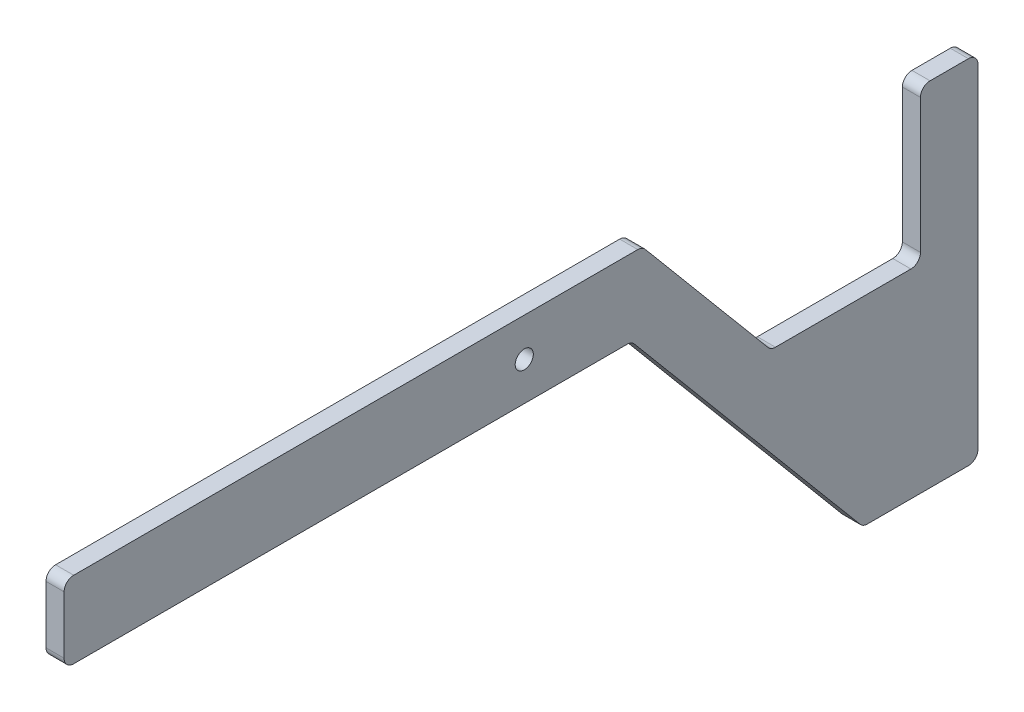
ISO-10303-21;
HEADER;
FILE_DESCRIPTION(('STEP AP214'),'2;1');
FILE_NAME('part.step','',(''),(''),'','','');
FILE_SCHEMA(('AUTOMOTIVE_DESIGN { 1 0 10303 214 1 1 1 1 }'));
ENDSEC;
DATA;
#1=APPLICATION_CONTEXT('core data for automotive mechanical design processes');
#2=APPLICATION_PROTOCOL_DEFINITION('international standard','automotive_design',2000,#1);
#3=PRODUCT_CONTEXT('',#1,'mechanical');
#4=PRODUCT('Part','Part','',(#3));
#5=PRODUCT_RELATED_PRODUCT_CATEGORY('part','',(#4));
#6=PRODUCT_DEFINITION_FORMATION('','',#4);
#7=PRODUCT_DEFINITION_CONTEXT('part definition',#1,'design');
#8=PRODUCT_DEFINITION('design','',#6,#7);
#9=PRODUCT_DEFINITION_SHAPE('','',#8);
#10=(LENGTH_UNIT() NAMED_UNIT(*) SI_UNIT(.MILLI.,.METRE.));
#11=(NAMED_UNIT(*) PLANE_ANGLE_UNIT() SI_UNIT($,.RADIAN.));
#12=(NAMED_UNIT(*) SI_UNIT($,.STERADIAN.) SOLID_ANGLE_UNIT());
#13=UNCERTAINTY_MEASURE_WITH_UNIT(LENGTH_MEASURE(1.E-05),#10,'distance_accuracy_value','');
#14=(GEOMETRIC_REPRESENTATION_CONTEXT(3) GLOBAL_UNCERTAINTY_ASSIGNED_CONTEXT((#13)) GLOBAL_UNIT_ASSIGNED_CONTEXT((#10,
#11,#12)) REPRESENTATION_CONTEXT('',''));
#15=CARTESIAN_POINT('',(0.,0.,0.));
#16=DIRECTION('',(0.,0.,1.));
#17=DIRECTION('',(1.,0.,0.));
#18=AXIS2_PLACEMENT_3D('',#15,#16,#17);
#19=CARTESIAN_POINT('',(1.5,0.,0.));
#20=DIRECTION('',(1.,0.,0.));
#21=DIRECTION('',(0.,0.,-1.));
#22=AXIS2_PLACEMENT_3D('',#19,#20,#21);
#23=PLANE('',#22);
#24=DIRECTION('',(0.,0.766044443118974,0.642787609686544));
#25=VECTOR('',#24,1.);
#26=CARTESIAN_POINT('',(1.5,29.1862932828329,-20.0716573882898));
#27=LINE('',#26,#25);
#28=CARTESIAN_POINT('',(1.5,4.35336795245555,-40.9089558740626));
#29=VERTEX_POINT('',#28);
#30=CARTESIAN_POINT('',(1.5,28.6192186132103,-20.5474895344201));
#31=VERTEX_POINT('',#30);
#32=EDGE_CURVE('E226',#29,#31,#27,.T.);
#33=ORIENTED_EDGE('',*,*,#32,.T.);
#34=CARTESIAN_POINT('',(1.5,27.5987932828329,-19.3313939809687));
#35=DIRECTION('',(1.,0.,0.));
#36=DIRECTION('',(0.,0.,-1.));
#37=AXIS2_PLACEMENT_3D('',#34,#35,#36);
#38=CIRCLE('',#37,1.5875);
#39=CARTESIAN_POINT('',(1.5,29.1862932828329,-19.3313939809687));
#40=VERTEX_POINT('',#39);
#41=EDGE_CURVE('E299',#31,#40,#38,.T.);
#42=ORIENTED_EDGE('',*,*,#41,.T.);
#43=DIRECTION('',(0.,0.,1.));
#44=VECTOR('',#43,1.);
#45=CARTESIAN_POINT('',(1.5,29.1862932828329,75.6680688155144));
#46=LINE('',#45,#44);
#47=CARTESIAN_POINT('',(1.5,29.1862932828329,74.0805688155144));
#48=VERTEX_POINT('',#47);
#49=EDGE_CURVE('E205',#40,#48,#46,.T.);
#50=ORIENTED_EDGE('',*,*,#49,.T.);
#51=CARTESIAN_POINT('',(1.5,27.5987932828329,74.0805688155144));
#52=DIRECTION('',(1.,0.,0.));
#53=DIRECTION('',(0.,0.,-1.));
#54=AXIS2_PLACEMENT_3D('',#51,#52,#53);
#55=CIRCLE('',#54,1.5875);
#56=CARTESIAN_POINT('',(1.5,27.5987932828329,75.6680688155144));
#57=VERTEX_POINT('',#56);
#58=EDGE_CURVE('E281',#48,#57,#55,.T.);
#59=ORIENTED_EDGE('',*,*,#58,.T.);
#60=DIRECTION('',(0.,-1.,0.));
#61=VECTOR('',#60,1.);
#62=CARTESIAN_POINT('',(1.5,16.4862932828329,75.6680688155144));
#63=LINE('',#62,#61);
#64=CARTESIAN_POINT('',(1.5,18.0737932828329,75.6680688155144));
#65=VERTEX_POINT('',#64);
#66=EDGE_CURVE('E397',#57,#65,#63,.T.);
#67=ORIENTED_EDGE('',*,*,#66,.T.);
#68=CARTESIAN_POINT('',(1.5,18.0737932828329,74.0805688155144));
#69=DIRECTION('',(1.,0.,0.));
#70=DIRECTION('',(0.,0.,-1.));
#71=AXIS2_PLACEMENT_3D('',#68,#69,#70);
#72=CIRCLE('',#71,1.5875);
#73=CARTESIAN_POINT('',(1.5,16.4862932828329,74.0805688155144));
#74=VERTEX_POINT('',#73);
#75=EDGE_CURVE('E284',#65,#74,#72,.T.);
#76=ORIENTED_EDGE('',*,*,#75,.T.);
#77=DIRECTION('',(0.,0.,-1.));
#78=VECTOR('',#77,1.);
#79=CARTESIAN_POINT('',(1.5,16.4862932828329,-18.2942182733514));
#80=LINE('',#79,#78);
#81=CARTESIAN_POINT('',(1.5,16.4862932828329,-17.5539548660304));
#82=VERTEX_POINT('',#81);
#83=EDGE_CURVE('E385',#74,#82,#80,.T.);
#84=ORIENTED_EDGE('',*,*,#83,.T.);
#85=CARTESIAN_POINT('',(1.5,14.8987932828329,-17.5539548660304));
#86=DIRECTION('',(1.,0.,0.));
#87=DIRECTION('',(0.,0.,-1.));
#88=AXIS2_PLACEMENT_3D('',#85,#86,#87);
#89=CIRCLE('',#88,1.5875);
#90=CARTESIAN_POINT('',(1.5,15.9192186132103,-18.7700504194817));
#91=VERTEX_POINT('',#90);
#92=EDGE_CURVE('E11',#82,#91,#89,.F.);
#93=ORIENTED_EDGE('',*,*,#92,.T.);
#94=DIRECTION('',(0.,-0.766044443118974,-0.642787609686544));
#95=VECTOR('',#94,1.);
#96=CARTESIAN_POINT('',(1.5,16.4862932828329,-18.2942182733514));
#97=LINE('',#96,#95);
#98=CARTESIAN_POINT('',(1.5,-28.6192186132103,-56.1422366693841));
#99=VERTEX_POINT('',#98);
#100=EDGE_CURVE('E383',#91,#99,#97,.T.);
#101=ORIENTED_EDGE('',*,*,#100,.T.);
#102=CARTESIAN_POINT('',(1.5,-27.5987932828329,-57.3583322228355));
#103=DIRECTION('',(1.,0.,0.));
#104=DIRECTION('',(0.,0.,-1.));
#105=AXIS2_PLACEMENT_3D('',#102,#103,#104);
#106=CIRCLE('',#105,1.5875);
#107=CARTESIAN_POINT('',(1.5,-29.1862932828329,-57.3583322228355));
#108=VERTEX_POINT('',#107);
#109=EDGE_CURVE('E287',#99,#108,#106,.T.);
#110=ORIENTED_EDGE('',*,*,#109,.T.);
#111=DIRECTION('',(0.,0.,-1.));
#112=VECTOR('',#111,1.);
#113=CARTESIAN_POINT('',(1.5,-29.1862932828329,-56.6180688155144));
#114=LINE('',#113,#112);
#115=CARTESIAN_POINT('',(1.5,-29.1862932828329,-74.0805688155144));
#116=VERTEX_POINT('',#115);
#117=EDGE_CURVE('E390',#108,#116,#114,.T.);
#118=ORIENTED_EDGE('',*,*,#117,.T.);
#119=CARTESIAN_POINT('',(1.5,-27.5987932828329,-74.0805688155144));
#120=DIRECTION('',(1.,0.,0.));
#121=DIRECTION('',(0.,0.,-1.));
#122=AXIS2_PLACEMENT_3D('',#119,#120,#121);
#123=CIRCLE('',#122,1.5875);
#124=CARTESIAN_POINT('',(1.5,-27.5987932828329,-75.6680688155144));
#125=VERTEX_POINT('',#124);
#126=EDGE_CURVE('E290',#116,#125,#123,.T.);
#127=ORIENTED_EDGE('',*,*,#126,.T.);
#128=DIRECTION('',(0.,1.,0.));
#129=VECTOR('',#128,1.);
#130=CARTESIAN_POINT('',(1.5,29.1862932828329,-75.6680688155144));
#131=LINE('',#130,#129);
#132=CARTESIAN_POINT('',(1.5,27.5987932828329,-75.6680688155144));
#133=VERTEX_POINT('',#132);
#134=EDGE_CURVE('E395',#125,#133,#131,.T.);
#135=ORIENTED_EDGE('',*,*,#134,.T.);
#136=CARTESIAN_POINT('',(1.5,27.5987932828329,-74.0805688155144));
#137=DIRECTION('',(1.,0.,0.));
#138=DIRECTION('',(0.,0.,-1.));
#139=AXIS2_PLACEMENT_3D('',#136,#137,#138);
#140=CIRCLE('',#139,1.5875);
#141=CARTESIAN_POINT('',(1.5,29.1862932828329,-74.0805688155144));
#142=VERTEX_POINT('',#141);
#143=EDGE_CURVE('E293',#133,#142,#140,.T.);
#144=ORIENTED_EDGE('',*,*,#143,.T.);
#145=DIRECTION('',(0.,0.,1.));
#146=VECTOR('',#145,1.);
#147=CARTESIAN_POINT('',(1.5,29.1862932828329,-66.1430688155144));
#148=LINE('',#147,#146);
#149=CARTESIAN_POINT('',(1.5,29.1862932828329,-67.7305688155144));
#150=VERTEX_POINT('',#149);
#151=EDGE_CURVE('E404',#142,#150,#148,.T.);
#152=ORIENTED_EDGE('',*,*,#151,.T.);
#153=CARTESIAN_POINT('',(1.5,27.5987932828329,-67.7305688155144));
#154=DIRECTION('',(1.,0.,0.));
#155=DIRECTION('',(0.,0.,-1.));
#156=AXIS2_PLACEMENT_3D('',#153,#154,#155);
#157=CIRCLE('',#156,1.5875);
#158=CARTESIAN_POINT('',(1.5,27.5987932828329,-66.1430688155144));
#159=VERTEX_POINT('',#158);
#160=EDGE_CURVE('E296',#150,#159,#157,.T.);
#161=ORIENTED_EDGE('',*,*,#160,.T.);
#162=DIRECTION('',(0.,-1.,0.));
#163=VECTOR('',#162,1.);
#164=CARTESIAN_POINT('',(1.5,3.78629328283292,-66.1430688155144));
#165=LINE('',#164,#163);
#166=CARTESIAN_POINT('',(1.5,5.37379328283292,-66.1430688155144));
#167=VERTEX_POINT('',#166);
#168=EDGE_CURVE('E408',#159,#167,#165,.T.);
#169=ORIENTED_EDGE('',*,*,#168,.T.);
#170=CARTESIAN_POINT('',(1.5,5.37379328283292,-64.5555688155144));
#171=DIRECTION('',(1.,0.,0.));
#172=DIRECTION('',(0.,0.,-1.));
#173=AXIS2_PLACEMENT_3D('',#170,#171,#172);
#174=CIRCLE('',#173,1.5875);
#175=CARTESIAN_POINT('',(1.5,3.78629328283292,-64.5555688155144));
#176=VERTEX_POINT('',#175);
#177=EDGE_CURVE('E68',#167,#176,#174,.F.);
#178=ORIENTED_EDGE('',*,*,#177,.T.);
#179=DIRECTION('',(0.,0.,1.));
#180=VECTOR('',#179,1.);
#181=CARTESIAN_POINT('',(1.5,3.78629328283292,-41.384788020193));
#182=LINE('',#181,#180);
#183=CARTESIAN_POINT('',(1.5,3.78629328283292,-42.125051427514));
#184=VERTEX_POINT('',#183);
#185=EDGE_CURVE('E410',#176,#184,#182,.T.);
#186=ORIENTED_EDGE('',*,*,#185,.T.);
#187=CARTESIAN_POINT('',(1.5,5.37379328283293,-42.125051427514));
#188=DIRECTION('',(1.,0.,0.));
#189=DIRECTION('',(0.,0.,-1.));
#190=AXIS2_PLACEMENT_3D('',#187,#188,#189);
#191=CIRCLE('',#190,1.5875);
#192=EDGE_CURVE('E360',#184,#29,#191,.F.);
#193=ORIENTED_EDGE('',*,*,#192,.T.);
#194=EDGE_LOOP('',(#33,#42,#50,#59,#67,#76,#84,#93,#101,#110,#118,#127,#135,#144,#152,#161,#169,
#178,#186,#193));
#195=FACE_BOUND('',#194,.T.);
#196=CARTESIAN_POINT('',(1.5,22.8362932828329,-0.531931184485581));
#197=DIRECTION('',(1.,0.,0.));
#198=DIRECTION('',(0.,0.,-1.));
#199=AXIS2_PLACEMENT_3D('',#196,#197,#198);
#200=CIRCLE('',#199,1.49999999999991);
#201=CARTESIAN_POINT('',(1.5,22.8362932828329,-2.03193118448549));
#202=VERTEX_POINT('',#201);
#203=EDGE_CURVE('E215',#202,#202,#200,.T.);
#204=ORIENTED_EDGE('',*,*,#203,.F.);
#205=EDGE_LOOP('',(#204));
#206=FACE_BOUND('',#205,.T.);
#207=ADVANCED_FACE('F45',(#195,#206),#23,.T.);
#208=CARTESIAN_POINT('',(-1.5,0.,0.));
#209=DIRECTION('',(1.,0.,0.));
#210=DIRECTION('',(0.,0.,-1.));
#211=AXIS2_PLACEMENT_3D('',#208,#209,#210);
#212=PLANE('',#211);
#213=DIRECTION('',(0.,0.,1.));
#214=VECTOR('',#213,1.);
#215=CARTESIAN_POINT('',(-1.5,29.1862932828329,75.6680688155144));
#216=LINE('',#215,#214);
#217=CARTESIAN_POINT('',(-1.5,29.1862932828329,-19.3313939809687));
#218=VERTEX_POINT('',#217);
#219=CARTESIAN_POINT('',(-1.5,29.1862932828329,74.0805688155144));
#220=VERTEX_POINT('',#219);
#221=EDGE_CURVE('E202',#218,#220,#216,.T.);
#222=ORIENTED_EDGE('',*,*,#221,.F.);
#223=CARTESIAN_POINT('',(-1.5,27.5987932828329,-19.3313939809687));
#224=DIRECTION('',(1.,0.,0.));
#225=DIRECTION('',(0.,0.,-1.));
#226=AXIS2_PLACEMENT_3D('',#223,#224,#225);
#227=CIRCLE('',#226,1.5875);
#228=CARTESIAN_POINT('',(-1.5,28.6192186132103,-20.5474895344201));
#229=VERTEX_POINT('',#228);
#230=EDGE_CURVE('E184',#218,#229,#227,.F.);
#231=ORIENTED_EDGE('',*,*,#230,.T.);
#232=DIRECTION('',(0.,0.766044443118974,0.642787609686544));
#233=VECTOR('',#232,1.);
#234=CARTESIAN_POINT('',(-1.5,29.1862932828329,-20.0716573882898));
#235=LINE('',#234,#233);
#236=CARTESIAN_POINT('',(-1.5,4.35336795245555,-40.9089558740626));
#237=VERTEX_POINT('',#236);
#238=EDGE_CURVE('E255',#237,#229,#235,.T.);
#239=ORIENTED_EDGE('',*,*,#238,.F.);
#240=CARTESIAN_POINT('',(-1.5,5.37379328283293,-42.125051427514));
#241=DIRECTION('',(1.,0.,0.));
#242=DIRECTION('',(0.,0.,-1.));
#243=AXIS2_PLACEMENT_3D('',#240,#241,#242);
#244=CIRCLE('',#243,1.5875);
#245=CARTESIAN_POINT('',(-1.5,3.78629328283292,-42.125051427514));
#246=VERTEX_POINT('',#245);
#247=EDGE_CURVE('E357',#237,#246,#244,.T.);
#248=ORIENTED_EDGE('',*,*,#247,.T.);
#249=DIRECTION('',(0.,0.,1.));
#250=VECTOR('',#249,1.);
#251=CARTESIAN_POINT('',(-1.5,3.78629328283292,-41.384788020193));
#252=LINE('',#251,#250);
#253=CARTESIAN_POINT('',(-1.5,3.78629328283292,-64.5555688155144));
#254=VERTEX_POINT('',#253);
#255=EDGE_CURVE('E252',#254,#246,#252,.T.);
#256=ORIENTED_EDGE('',*,*,#255,.F.);
#257=CARTESIAN_POINT('',(-1.5,5.37379328283292,-64.5555688155144));
#258=DIRECTION('',(1.,0.,0.));
#259=DIRECTION('',(0.,0.,-1.));
#260=AXIS2_PLACEMENT_3D('',#257,#258,#259);
#261=CIRCLE('',#260,1.5875);
#262=CARTESIAN_POINT('',(-1.5,5.37379328283292,-66.1430688155144));
#263=VERTEX_POINT('',#262);
#264=EDGE_CURVE('E363',#254,#263,#261,.T.);
#265=ORIENTED_EDGE('',*,*,#264,.T.);
#266=DIRECTION('',(0.,-1.,0.));
#267=VECTOR('',#266,1.);
#268=CARTESIAN_POINT('',(-1.5,3.78629328283292,-66.1430688155144));
#269=LINE('',#268,#267);
#270=CARTESIAN_POINT('',(-1.5,27.5987932828329,-66.1430688155144));
#271=VERTEX_POINT('',#270);
#272=EDGE_CURVE('E248',#271,#263,#269,.T.);
#273=ORIENTED_EDGE('',*,*,#272,.F.);
#274=CARTESIAN_POINT('',(-1.5,27.5987932828329,-67.7305688155144));
#275=DIRECTION('',(1.,0.,0.));
#276=DIRECTION('',(0.,0.,-1.));
#277=AXIS2_PLACEMENT_3D('',#274,#275,#276);
#278=CIRCLE('',#277,1.5875);
#279=CARTESIAN_POINT('',(-1.5,29.1862932828329,-67.7305688155144));
#280=VERTEX_POINT('',#279);
#281=EDGE_CURVE('E196',#271,#280,#278,.F.);
#282=ORIENTED_EDGE('',*,*,#281,.T.);
#283=DIRECTION('',(0.,0.,1.));
#284=VECTOR('',#283,1.);
#285=CARTESIAN_POINT('',(-1.5,29.1862932828329,-66.1430688155144));
#286=LINE('',#285,#284);
#287=CARTESIAN_POINT('',(-1.5,29.1862932828329,-74.0805688155144));
#288=VERTEX_POINT('',#287);
#289=EDGE_CURVE('E244',#288,#280,#286,.T.);
#290=ORIENTED_EDGE('',*,*,#289,.F.);
#291=CARTESIAN_POINT('',(-1.5,27.5987932828329,-74.0805688155144));
#292=DIRECTION('',(1.,0.,0.));
#293=DIRECTION('',(0.,0.,-1.));
#294=AXIS2_PLACEMENT_3D('',#291,#292,#293);
#295=CIRCLE('',#294,1.5875);
#296=CARTESIAN_POINT('',(-1.5,27.5987932828329,-75.6680688155144));
#297=VERTEX_POINT('',#296);
#298=EDGE_CURVE('E271',#288,#297,#295,.F.);
#299=ORIENTED_EDGE('',*,*,#298,.T.);
#300=DIRECTION('',(0.,1.,0.));
#301=VECTOR('',#300,1.);
#302=CARTESIAN_POINT('',(-1.5,29.1862932828329,-75.6680688155144));
#303=LINE('',#302,#301);
#304=CARTESIAN_POINT('',(-1.5,-27.5987932828329,-75.6680688155144));
#305=VERTEX_POINT('',#304);
#306=EDGE_CURVE('E240',#305,#297,#303,.T.);
#307=ORIENTED_EDGE('',*,*,#306,.F.);
#308=CARTESIAN_POINT('',(-1.5,-27.5987932828329,-74.0805688155144));
#309=DIRECTION('',(1.,0.,0.));
#310=DIRECTION('',(0.,0.,-1.));
#311=AXIS2_PLACEMENT_3D('',#308,#309,#310);
#312=CIRCLE('',#311,1.5875);
#313=CARTESIAN_POINT('',(-1.5,-29.1862932828329,-74.0805688155144));
#314=VERTEX_POINT('',#313);
#315=EDGE_CURVE('E268',#305,#314,#312,.F.);
#316=ORIENTED_EDGE('',*,*,#315,.T.);
#317=DIRECTION('',(0.,0.,-1.));
#318=VECTOR('',#317,1.);
#319=CARTESIAN_POINT('',(-1.5,-29.1862932828329,-56.6180688155144));
#320=LINE('',#319,#318);
#321=CARTESIAN_POINT('',(-1.5,-29.1862932828329,-57.3583322228355));
#322=VERTEX_POINT('',#321);
#323=EDGE_CURVE('E236',#322,#314,#320,.T.);
#324=ORIENTED_EDGE('',*,*,#323,.F.);
#325=CARTESIAN_POINT('',(-1.5,-27.5987932828329,-57.3583322228355));
#326=DIRECTION('',(1.,0.,0.));
#327=DIRECTION('',(0.,0.,-1.));
#328=AXIS2_PLACEMENT_3D('',#325,#326,#327);
#329=CIRCLE('',#328,1.5875);
#330=CARTESIAN_POINT('',(-1.5,-28.6192186132103,-56.1422366693841));
#331=VERTEX_POINT('',#330);
#332=EDGE_CURVE('E265',#322,#331,#329,.F.);
#333=ORIENTED_EDGE('',*,*,#332,.T.);
#334=DIRECTION('',(0.,-0.766044443118974,-0.642787609686544));
#335=VECTOR('',#334,1.);
#336=CARTESIAN_POINT('',(-1.5,16.4862932828329,-18.2942182733514));
#337=LINE('',#336,#335);
#338=CARTESIAN_POINT('',(-1.5,15.9192186132103,-18.7700504194817));
#339=VERTEX_POINT('',#338);
#340=EDGE_CURVE('E232',#339,#331,#337,.T.);
#341=ORIENTED_EDGE('',*,*,#340,.F.);
#342=CARTESIAN_POINT('',(-1.5,14.8987932828329,-17.5539548660304));
#343=DIRECTION('',(1.,0.,0.));
#344=DIRECTION('',(0.,0.,-1.));
#345=AXIS2_PLACEMENT_3D('',#342,#343,#344);
#346=CIRCLE('',#345,1.5875);
#347=CARTESIAN_POINT('',(-1.5,16.4862932828329,-17.5539548660304));
#348=VERTEX_POINT('',#347);
#349=EDGE_CURVE('E54',#339,#348,#346,.T.);
#350=ORIENTED_EDGE('',*,*,#349,.T.);
#351=DIRECTION('',(0.,0.,-1.));
#352=VECTOR('',#351,1.);
#353=CARTESIAN_POINT('',(-1.5,16.4862932828329,-18.2942182733514));
#354=LINE('',#353,#352);
#355=CARTESIAN_POINT('',(-1.5,16.4862932828329,74.0805688155144));
#356=VERTEX_POINT('',#355);
#357=EDGE_CURVE('E220',#356,#348,#354,.T.);
#358=ORIENTED_EDGE('',*,*,#357,.F.);
#359=CARTESIAN_POINT('',(-1.5,18.0737932828329,74.0805688155144));
#360=DIRECTION('',(1.,0.,0.));
#361=DIRECTION('',(0.,0.,-1.));
#362=AXIS2_PLACEMENT_3D('',#359,#360,#361);
#363=CIRCLE('',#362,1.5875);
#364=CARTESIAN_POINT('',(-1.5,18.0737932828329,75.6680688155144));
#365=VERTEX_POINT('',#364);
#366=EDGE_CURVE('E262',#356,#365,#363,.F.);
#367=ORIENTED_EDGE('',*,*,#366,.T.);
#368=DIRECTION('',(0.,-1.,0.));
#369=VECTOR('',#368,1.);
#370=CARTESIAN_POINT('',(-1.5,16.4862932828329,75.6680688155144));
#371=LINE('',#370,#369);
#372=CARTESIAN_POINT('',(-1.5,27.5987932828329,75.6680688155144));
#373=VERTEX_POINT('',#372);
#374=EDGE_CURVE('E214',#373,#365,#371,.T.);
#375=ORIENTED_EDGE('',*,*,#374,.F.);
#376=CARTESIAN_POINT('',(-1.5,27.5987932828329,74.0805688155144));
#377=DIRECTION('',(1.,0.,0.));
#378=DIRECTION('',(0.,0.,-1.));
#379=AXIS2_PLACEMENT_3D('',#376,#377,#378);
#380=CIRCLE('',#379,1.5875);
#381=EDGE_CURVE('E207',#373,#220,#380,.F.);
#382=ORIENTED_EDGE('',*,*,#381,.T.);
#383=EDGE_LOOP('',(#222,#231,#239,#248,#256,#265,#273,#282,#290,#299,#307,#316,#324,#333,#341,
#350,#358,#367,#375,#382));
#384=FACE_BOUND('',#383,.T.);
#385=CARTESIAN_POINT('',(-1.5,22.8362932828329,-0.531931184485581));
#386=DIRECTION('',(1.,0.,0.));
#387=DIRECTION('',(0.,0.,-1.));
#388=AXIS2_PLACEMENT_3D('',#385,#386,#387);
#389=CIRCLE('',#388,1.49999999999991);
#390=CARTESIAN_POINT('',(-1.5,22.8362932828329,-2.03193118448549));
#391=VERTEX_POINT('',#390);
#392=EDGE_CURVE('E223',#391,#391,#389,.T.);
#393=ORIENTED_EDGE('',*,*,#392,.T.);
#394=EDGE_LOOP('',(#393));
#395=FACE_BOUND('',#394,.T.);
#396=ADVANCED_FACE('F210',(#384,#395),#212,.F.);
#397=CARTESIAN_POINT('',(1.5,29.1862932828329,75.6680688155144));
#398=DIRECTION('',(0.,-1.,0.));
#399=DIRECTION('',(0.,0.,-1.));
#400=AXIS2_PLACEMENT_3D('',#397,#398,#399);
#401=PLANE('',#400);
#402=ORIENTED_EDGE('',*,*,#49,.F.);
#403=DIRECTION('',(-1.,0.,0.));
#404=VECTOR('',#403,1.);
#405=CARTESIAN_POINT('',(1.5,29.1862932828329,-19.3313939809687));
#406=LINE('',#405,#404);
#407=EDGE_CURVE('E188',#40,#218,#406,.T.);
#408=ORIENTED_EDGE('',*,*,#407,.T.);
#409=ORIENTED_EDGE('',*,*,#221,.T.);
#410=DIRECTION('',(-1.,0.,0.));
#411=VECTOR('',#410,1.);
#412=CARTESIAN_POINT('',(1.5,29.1862932828329,74.0805688155144));
#413=LINE('',#412,#411);
#414=EDGE_CURVE('E208',#220,#48,#413,.F.);
#415=ORIENTED_EDGE('',*,*,#414,.T.);
#416=EDGE_LOOP('',(#402,#408,#409,#415));
#417=FACE_BOUND('',#416,.T.);
#418=ADVANCED_FACE('F201',(#417),#401,.F.);
#419=CARTESIAN_POINT('',(1.5,16.4862932828329,75.6680688155144));
#420=DIRECTION('',(0.,0.,-1.));
#421=DIRECTION('',(-1.,0.,0.));
#422=AXIS2_PLACEMENT_3D('',#419,#420,#421);
#423=PLANE('',#422);
#424=ORIENTED_EDGE('',*,*,#374,.T.);
#425=DIRECTION('',(-1.,0.,0.));
#426=VECTOR('',#425,1.);
#427=CARTESIAN_POINT('',(1.5,18.0737932828329,75.6680688155144));
#428=LINE('',#427,#426);
#429=EDGE_CURVE('E354',#365,#65,#428,.F.);
#430=ORIENTED_EDGE('',*,*,#429,.T.);
#431=ORIENTED_EDGE('',*,*,#66,.F.);
#432=DIRECTION('',(-1.,0.,0.));
#433=VECTOR('',#432,1.);
#434=CARTESIAN_POINT('',(1.5,27.5987932828329,75.6680688155144));
#435=LINE('',#434,#433);
#436=EDGE_CURVE('E350',#57,#373,#435,.T.);
#437=ORIENTED_EDGE('',*,*,#436,.T.);
#438=EDGE_LOOP('',(#424,#430,#431,#437));
#439=FACE_BOUND('',#438,.T.);
#440=ADVANCED_FACE('F497',(#439),#423,.F.);
#441=CARTESIAN_POINT('',(1.5,16.4862932828329,-18.2942182733514));
#442=DIRECTION('',(0.,1.,0.));
#443=DIRECTION('',(0.,0.,1.));
#444=AXIS2_PLACEMENT_3D('',#441,#442,#443);
#445=PLANE('',#444);
#446=ORIENTED_EDGE('',*,*,#83,.F.);
#447=DIRECTION('',(-1.,0.,0.));
#448=VECTOR('',#447,1.);
#449=CARTESIAN_POINT('',(1.5,16.4862932828329,74.0805688155144));
#450=LINE('',#449,#448);
#451=EDGE_CURVE('E346',#74,#356,#450,.T.);
#452=ORIENTED_EDGE('',*,*,#451,.T.);
#453=ORIENTED_EDGE('',*,*,#357,.T.);
#454=DIRECTION('',(-1.,0.,0.));
#455=VECTOR('',#454,1.);
#456=CARTESIAN_POINT('',(1.5,16.4862932828329,-17.5539548660304));
#457=LINE('',#456,#455);
#458=EDGE_CURVE('E343',#348,#82,#457,.F.);
#459=ORIENTED_EDGE('',*,*,#458,.T.);
#460=EDGE_LOOP('',(#446,#452,#453,#459));
#461=FACE_BOUND('',#460,.T.);
#462=ADVANCED_FACE('F375',(#461),#445,.F.);
#463=CARTESIAN_POINT('',(1.5,16.4862932828329,-18.2942182733514));
#464=DIRECTION('',(0.,0.642787609686544,-0.766044443118974));
#465=DIRECTION('',(0.,0.766044443118974,0.642787609686544));
#466=AXIS2_PLACEMENT_3D('',#463,#464,#465);
#467=PLANE('',#466);
#468=ORIENTED_EDGE('',*,*,#340,.T.);
#469=DIRECTION('',(-1.,0.,0.));
#470=VECTOR('',#469,1.);
#471=CARTESIAN_POINT('',(1.5,-28.6192186132103,-56.1422366693841));
#472=LINE('',#471,#470);
#473=EDGE_CURVE('E340',#331,#99,#472,.F.);
#474=ORIENTED_EDGE('',*,*,#473,.T.);
#475=ORIENTED_EDGE('',*,*,#100,.F.);
#476=DIRECTION('',(-1.,0.,0.));
#477=VECTOR('',#476,1.);
#478=CARTESIAN_POINT('',(-1.5,15.9192186132103,-18.7700504194817));
#479=LINE('',#478,#477);
#480=EDGE_CURVE('E336',#91,#339,#479,.T.);
#481=ORIENTED_EDGE('',*,*,#480,.T.);
#482=EDGE_LOOP('',(#468,#474,#475,#481));
#483=FACE_BOUND('',#482,.T.);
#484=ADVANCED_FACE('F387',(#483),#467,.F.);
#485=CARTESIAN_POINT('',(1.5,-29.1862932828329,-56.6180688155144));
#486=DIRECTION('',(0.,1.,0.));
#487=DIRECTION('',(0.,0.,1.));
#488=AXIS2_PLACEMENT_3D('',#485,#486,#487);
#489=PLANE('',#488);
#490=ORIENTED_EDGE('',*,*,#323,.T.);
#491=DIRECTION('',(-1.,0.,0.));
#492=VECTOR('',#491,1.);
#493=CARTESIAN_POINT('',(1.5,-29.1862932828329,-74.0805688155144));
#494=LINE('',#493,#492);
#495=EDGE_CURVE('E333',#314,#116,#494,.F.);
#496=ORIENTED_EDGE('',*,*,#495,.T.);
#497=ORIENTED_EDGE('',*,*,#117,.F.);
#498=DIRECTION('',(-1.,0.,0.));
#499=VECTOR('',#498,1.);
#500=CARTESIAN_POINT('',(1.5,-29.1862932828329,-57.3583322228355));
#501=LINE('',#500,#499);
#502=EDGE_CURVE('E329',#108,#322,#501,.T.);
#503=ORIENTED_EDGE('',*,*,#502,.T.);
#504=EDGE_LOOP('',(#490,#496,#497,#503));
#505=FACE_BOUND('',#504,.T.);
#506=ADVANCED_FACE('F455',(#505),#489,.F.);
#507=CARTESIAN_POINT('',(1.5,29.1862932828329,-75.6680688155144));
#508=DIRECTION('',(0.,0.,1.));
#509=DIRECTION('',(1.,0.,0.));
#510=AXIS2_PLACEMENT_3D('',#507,#508,#509);
#511=PLANE('',#510);
#512=ORIENTED_EDGE('',*,*,#306,.T.);
#513=DIRECTION('',(-1.,0.,0.));
#514=VECTOR('',#513,1.);
#515=CARTESIAN_POINT('',(1.5,27.5987932828329,-75.6680688155144));
#516=LINE('',#515,#514);
#517=EDGE_CURVE('E326',#297,#133,#516,.F.);
#518=ORIENTED_EDGE('',*,*,#517,.T.);
#519=ORIENTED_EDGE('',*,*,#134,.F.);
#520=DIRECTION('',(-1.,0.,0.));
#521=VECTOR('',#520,1.);
#522=CARTESIAN_POINT('',(1.5,-27.5987932828329,-75.6680688155144));
#523=LINE('',#522,#521);
#524=EDGE_CURVE('E322',#125,#305,#523,.T.);
#525=ORIENTED_EDGE('',*,*,#524,.T.);
#526=EDGE_LOOP('',(#512,#518,#519,#525));
#527=FACE_BOUND('',#526,.T.);
#528=ADVANCED_FACE('F446',(#527),#511,.F.);
#529=CARTESIAN_POINT('',(1.5,29.1862932828329,-66.1430688155144));
#530=DIRECTION('',(0.,-1.,0.));
#531=DIRECTION('',(0.,0.,-1.));
#532=AXIS2_PLACEMENT_3D('',#529,#530,#531);
#533=PLANE('',#532);
#534=ORIENTED_EDGE('',*,*,#289,.T.);
#535=DIRECTION('',(-1.,0.,0.));
#536=VECTOR('',#535,1.);
#537=CARTESIAN_POINT('',(1.5,29.1862932828329,-67.7305688155144));
#538=LINE('',#537,#536);
#539=EDGE_CURVE('E319',#280,#150,#538,.F.);
#540=ORIENTED_EDGE('',*,*,#539,.T.);
#541=ORIENTED_EDGE('',*,*,#151,.F.);
#542=DIRECTION('',(-1.,0.,0.));
#543=VECTOR('',#542,1.);
#544=CARTESIAN_POINT('',(1.5,29.1862932828329,-74.0805688155144));
#545=LINE('',#544,#543);
#546=EDGE_CURVE('E315',#142,#288,#545,.T.);
#547=ORIENTED_EDGE('',*,*,#546,.T.);
#548=EDGE_LOOP('',(#534,#540,#541,#547));
#549=FACE_BOUND('',#548,.T.);
#550=ADVANCED_FACE('F437',(#549),#533,.F.);
#551=CARTESIAN_POINT('',(1.5,3.78629328283292,-66.1430688155144));
#552=DIRECTION('',(0.,0.,-1.));
#553=DIRECTION('',(-1.,0.,0.));
#554=AXIS2_PLACEMENT_3D('',#551,#552,#553);
#555=PLANE('',#554);
#556=ORIENTED_EDGE('',*,*,#272,.T.);
#557=DIRECTION('',(-1.,0.,0.));
#558=VECTOR('',#557,1.);
#559=CARTESIAN_POINT('',(1.5,5.37379328283292,-66.1430688155144));
#560=LINE('',#559,#558);
#561=EDGE_CURVE('E312',#263,#167,#560,.F.);
#562=ORIENTED_EDGE('',*,*,#561,.T.);
#563=ORIENTED_EDGE('',*,*,#168,.F.);
#564=DIRECTION('',(-1.,0.,0.));
#565=VECTOR('',#564,1.);
#566=CARTESIAN_POINT('',(1.5,27.5987932828329,-66.1430688155144));
#567=LINE('',#566,#565);
#568=EDGE_CURVE('E308',#159,#271,#567,.T.);
#569=ORIENTED_EDGE('',*,*,#568,.T.);
#570=EDGE_LOOP('',(#556,#562,#563,#569));
#571=FACE_BOUND('',#570,.T.);
#572=ADVANCED_FACE('F428',(#571),#555,.F.);
#573=CARTESIAN_POINT('',(1.5,3.78629328283292,-41.384788020193));
#574=DIRECTION('',(0.,-1.,0.));
#575=DIRECTION('',(0.,0.,-1.));
#576=AXIS2_PLACEMENT_3D('',#573,#574,#575);
#577=PLANE('',#576);
#578=ORIENTED_EDGE('',*,*,#255,.T.);
#579=DIRECTION('',(-1.,0.,0.));
#580=VECTOR('',#579,1.);
#581=CARTESIAN_POINT('',(1.5,3.78629328283292,-42.125051427514));
#582=LINE('',#581,#580);
#583=EDGE_CURVE('E61',#246,#184,#582,.F.);
#584=ORIENTED_EDGE('',*,*,#583,.T.);
#585=ORIENTED_EDGE('',*,*,#185,.F.);
#586=DIRECTION('',(-1.,0.,0.));
#587=VECTOR('',#586,1.);
#588=CARTESIAN_POINT('',(-1.5,3.78629328283292,-64.5555688155144));
#589=LINE('',#588,#587);
#590=EDGE_CURVE('E302',#176,#254,#589,.T.);
#591=ORIENTED_EDGE('',*,*,#590,.T.);
#592=EDGE_LOOP('',(#578,#584,#585,#591));
#593=FACE_BOUND('',#592,.T.);
#594=ADVANCED_FACE('F421',(#593),#577,.F.);
#595=CARTESIAN_POINT('',(1.5,29.1862932828329,-20.0716573882898));
#596=DIRECTION('',(0.,-0.642787609686544,0.766044443118974));
#597=DIRECTION('',(0.,-0.766044443118974,-0.642787609686544));
#598=AXIS2_PLACEMENT_3D('',#595,#596,#597);
#599=PLANE('',#598);
#600=ORIENTED_EDGE('',*,*,#238,.T.);
#601=DIRECTION('',(-1.,0.,0.));
#602=VECTOR('',#601,1.);
#603=CARTESIAN_POINT('',(1.5,28.6192186132103,-20.5474895344201));
#604=LINE('',#603,#602);
#605=EDGE_CURVE('E189',#229,#31,#604,.F.);
#606=ORIENTED_EDGE('',*,*,#605,.T.);
#607=ORIENTED_EDGE('',*,*,#32,.F.);
#608=DIRECTION('',(-1.,0.,0.));
#609=VECTOR('',#608,1.);
#610=CARTESIAN_POINT('',(-1.5,4.35336795245554,-40.9089558740627));
#611=LINE('',#610,#609);
#612=EDGE_CURVE('E195',#29,#237,#611,.T.);
#613=ORIENTED_EDGE('',*,*,#612,.T.);
#614=EDGE_LOOP('',(#600,#606,#607,#613));
#615=FACE_BOUND('',#614,.T.);
#616=ADVANCED_FACE('F417',(#615),#599,.F.);
#617=CARTESIAN_POINT('',(1.5,22.8362932828329,-0.531931184485581));
#618=DIRECTION('',(-1.,0.,0.));
#619=DIRECTION('',(0.,0.,1.));
#620=AXIS2_PLACEMENT_3D('',#617,#618,#619);
#621=CYLINDRICAL_SURFACE('',#620,1.49999999999991);
#622=ORIENTED_EDGE('',*,*,#203,.T.);
#623=EDGE_LOOP('',(#622));
#624=FACE_BOUND('',#623,.T.);
#625=ORIENTED_EDGE('',*,*,#392,.F.);
#626=EDGE_LOOP('',(#625));
#627=FACE_BOUND('',#626,.T.);
#628=ADVANCED_FACE('F479',(#624,#627),#621,.F.);
#629=CARTESIAN_POINT('',(1.5,27.5987932828329,-19.3313939809687));
#630=DIRECTION('',(-1.,0.,0.));
#631=DIRECTION('',(0.,0.,1.));
#632=AXIS2_PLACEMENT_3D('',#629,#630,#631);
#633=CYLINDRICAL_SURFACE('',#632,1.5875);
#634=ORIENTED_EDGE('',*,*,#41,.F.);
#635=ORIENTED_EDGE('',*,*,#605,.F.);
#636=ORIENTED_EDGE('',*,*,#230,.F.);
#637=ORIENTED_EDGE('',*,*,#407,.F.);
#638=EDGE_LOOP('',(#634,#635,#636,#637));
#639=FACE_BOUND('',#638,.T.);
#640=ADVANCED_FACE('F187',(#639),#633,.T.);
#641=CARTESIAN_POINT('',(1.5,5.37379328283293,-42.125051427514));
#642=DIRECTION('',(1.,0.,0.));
#643=DIRECTION('',(0.,0.,-1.));
#644=AXIS2_PLACEMENT_3D('',#641,#642,#643);
#645=CYLINDRICAL_SURFACE('',#644,1.5875);
#646=ORIENTED_EDGE('',*,*,#192,.F.);
#647=ORIENTED_EDGE('',*,*,#583,.F.);
#648=ORIENTED_EDGE('',*,*,#247,.F.);
#649=ORIENTED_EDGE('',*,*,#612,.F.);
#650=EDGE_LOOP('',(#646,#647,#648,#649));
#651=FACE_BOUND('',#650,.T.);
#652=ADVANCED_FACE('F419',(#651),#645,.F.);
#653=CARTESIAN_POINT('',(1.5,5.37379328283292,-64.5555688155144));
#654=DIRECTION('',(1.,0.,0.));
#655=DIRECTION('',(0.,0.,-1.));
#656=AXIS2_PLACEMENT_3D('',#653,#654,#655);
#657=CYLINDRICAL_SURFACE('',#656,1.5875);
#658=ORIENTED_EDGE('',*,*,#177,.F.);
#659=ORIENTED_EDGE('',*,*,#561,.F.);
#660=ORIENTED_EDGE('',*,*,#264,.F.);
#661=ORIENTED_EDGE('',*,*,#590,.F.);
#662=EDGE_LOOP('',(#658,#659,#660,#661));
#663=FACE_BOUND('',#662,.T.);
#664=ADVANCED_FACE('F424',(#663),#657,.F.);
#665=CARTESIAN_POINT('',(1.5,27.5987932828329,-67.7305688155144));
#666=DIRECTION('',(-1.,0.,0.));
#667=DIRECTION('',(0.,0.,1.));
#668=AXIS2_PLACEMENT_3D('',#665,#666,#667);
#669=CYLINDRICAL_SURFACE('',#668,1.5875);
#670=ORIENTED_EDGE('',*,*,#160,.F.);
#671=ORIENTED_EDGE('',*,*,#539,.F.);
#672=ORIENTED_EDGE('',*,*,#281,.F.);
#673=ORIENTED_EDGE('',*,*,#568,.F.);
#674=EDGE_LOOP('',(#670,#671,#672,#673));
#675=FACE_BOUND('',#674,.T.);
#676=ADVANCED_FACE('F433',(#675),#669,.T.);
#677=CARTESIAN_POINT('',(1.5,27.5987932828329,-74.0805688155144));
#678=DIRECTION('',(-1.,0.,0.));
#679=DIRECTION('',(0.,0.,1.));
#680=AXIS2_PLACEMENT_3D('',#677,#678,#679);
#681=CYLINDRICAL_SURFACE('',#680,1.5875);
#682=ORIENTED_EDGE('',*,*,#143,.F.);
#683=ORIENTED_EDGE('',*,*,#517,.F.);
#684=ORIENTED_EDGE('',*,*,#298,.F.);
#685=ORIENTED_EDGE('',*,*,#546,.F.);
#686=EDGE_LOOP('',(#682,#683,#684,#685));
#687=FACE_BOUND('',#686,.T.);
#688=ADVANCED_FACE('F442',(#687),#681,.T.);
#689=CARTESIAN_POINT('',(1.5,-27.5987932828329,-74.0805688155144));
#690=DIRECTION('',(-1.,0.,0.));
#691=DIRECTION('',(0.,0.,1.));
#692=AXIS2_PLACEMENT_3D('',#689,#690,#691);
#693=CYLINDRICAL_SURFACE('',#692,1.5875);
#694=ORIENTED_EDGE('',*,*,#126,.F.);
#695=ORIENTED_EDGE('',*,*,#495,.F.);
#696=ORIENTED_EDGE('',*,*,#315,.F.);
#697=ORIENTED_EDGE('',*,*,#524,.F.);
#698=EDGE_LOOP('',(#694,#695,#696,#697));
#699=FACE_BOUND('',#698,.T.);
#700=ADVANCED_FACE('F451',(#699),#693,.T.);
#701=CARTESIAN_POINT('',(1.5,-27.5987932828329,-57.3583322228355));
#702=DIRECTION('',(-1.,0.,0.));
#703=DIRECTION('',(0.,0.,1.));
#704=AXIS2_PLACEMENT_3D('',#701,#702,#703);
#705=CYLINDRICAL_SURFACE('',#704,1.5875);
#706=ORIENTED_EDGE('',*,*,#109,.F.);
#707=ORIENTED_EDGE('',*,*,#473,.F.);
#708=ORIENTED_EDGE('',*,*,#332,.F.);
#709=ORIENTED_EDGE('',*,*,#502,.F.);
#710=EDGE_LOOP('',(#706,#707,#708,#709));
#711=FACE_BOUND('',#710,.T.);
#712=ADVANCED_FACE('F459',(#711),#705,.T.);
#713=CARTESIAN_POINT('',(1.5,18.0737932828329,74.0805688155144));
#714=DIRECTION('',(-1.,0.,0.));
#715=DIRECTION('',(0.,0.,1.));
#716=AXIS2_PLACEMENT_3D('',#713,#714,#715);
#717=CYLINDRICAL_SURFACE('',#716,1.5875);
#718=ORIENTED_EDGE('',*,*,#75,.F.);
#719=ORIENTED_EDGE('',*,*,#429,.F.);
#720=ORIENTED_EDGE('',*,*,#366,.F.);
#721=ORIENTED_EDGE('',*,*,#451,.F.);
#722=EDGE_LOOP('',(#718,#719,#720,#721));
#723=FACE_BOUND('',#722,.T.);
#724=ADVANCED_FACE('F461',(#723),#717,.T.);
#725=CARTESIAN_POINT('',(1.5,27.5987932828329,74.0805688155144));
#726=DIRECTION('',(-1.,0.,0.));
#727=DIRECTION('',(0.,0.,1.));
#728=AXIS2_PLACEMENT_3D('',#725,#726,#727);
#729=CYLINDRICAL_SURFACE('',#728,1.5875);
#730=ORIENTED_EDGE('',*,*,#58,.F.);
#731=ORIENTED_EDGE('',*,*,#414,.F.);
#732=ORIENTED_EDGE('',*,*,#381,.F.);
#733=ORIENTED_EDGE('',*,*,#436,.F.);
#734=EDGE_LOOP('',(#730,#731,#732,#733));
#735=FACE_BOUND('',#734,.T.);
#736=ADVANCED_FACE('F467',(#735),#729,.T.);
#737=CARTESIAN_POINT('',(1.5,14.8987932828329,-17.5539548660304));
#738=DIRECTION('',(1.,0.,0.));
#739=DIRECTION('',(0.,0.,-1.));
#740=AXIS2_PLACEMENT_3D('',#737,#738,#739);
#741=CYLINDRICAL_SURFACE('',#740,1.5875);
#742=ORIENTED_EDGE('',*,*,#92,.F.);
#743=ORIENTED_EDGE('',*,*,#458,.F.);
#744=ORIENTED_EDGE('',*,*,#349,.F.);
#745=ORIENTED_EDGE('',*,*,#480,.F.);
#746=EDGE_LOOP('',(#742,#743,#744,#745));
#747=FACE_BOUND('',#746,.T.);
#748=ADVANCED_FACE('F47',(#747),#741,.F.);
#749=CLOSED_SHELL('',(#207,#396,#418,#440,#462,#484,#506,#528,#550,#572,#594,#616,#628,#640,
#652,#664,#676,#688,#700,#712,#724,#736,#748));
#750=MANIFOLD_SOLID_BREP('B2',#749);
#751=ADVANCED_BREP_SHAPE_REPRESENTATION('',(#18,#750),#14);
#752=SHAPE_DEFINITION_REPRESENTATION(#9,#751);
ENDSEC;
END-ISO-10303-21;
